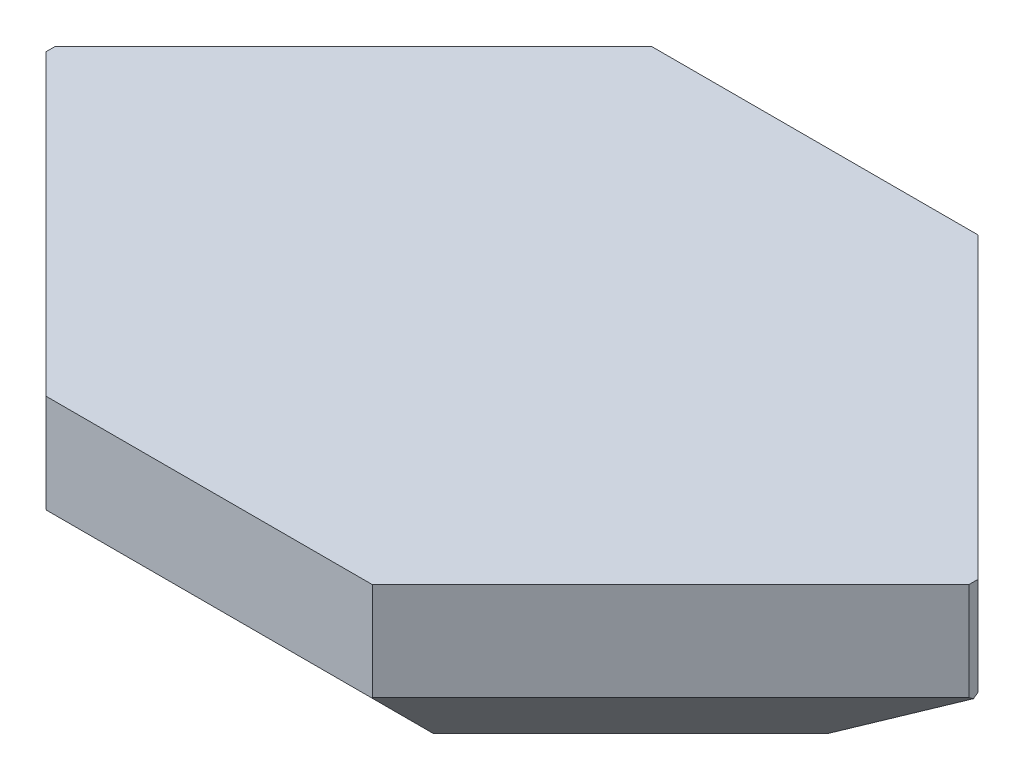
ISO-10303-21;
HEADER;
FILE_DESCRIPTION(('STEP AP214'),'2;1');
FILE_NAME('part.step','',(''),(''),'','','');
FILE_SCHEMA(('AUTOMOTIVE_DESIGN { 1 0 10303 214 1 1 1 1 }'));
ENDSEC;
DATA;
#1=APPLICATION_CONTEXT('core data for automotive mechanical design processes');
#2=APPLICATION_PROTOCOL_DEFINITION('international standard','automotive_design',2000,#1);
#3=PRODUCT_CONTEXT('',#1,'mechanical');
#4=PRODUCT('Part','Part','',(#3));
#5=PRODUCT_RELATED_PRODUCT_CATEGORY('part','',(#4));
#6=PRODUCT_DEFINITION_FORMATION('','',#4);
#7=PRODUCT_DEFINITION_CONTEXT('part definition',#1,'design');
#8=PRODUCT_DEFINITION('design','',#6,#7);
#9=PRODUCT_DEFINITION_SHAPE('','',#8);
#10=(LENGTH_UNIT() NAMED_UNIT(*) SI_UNIT(.MILLI.,.METRE.));
#11=(NAMED_UNIT(*) PLANE_ANGLE_UNIT() SI_UNIT($,.RADIAN.));
#12=(NAMED_UNIT(*) SI_UNIT($,.STERADIAN.) SOLID_ANGLE_UNIT());
#13=UNCERTAINTY_MEASURE_WITH_UNIT(LENGTH_MEASURE(1.E-05),#10,'distance_accuracy_value','');
#14=(GEOMETRIC_REPRESENTATION_CONTEXT(3) GLOBAL_UNCERTAINTY_ASSIGNED_CONTEXT((#13)) GLOBAL_UNIT_ASSIGNED_CONTEXT((#10,
#11,#12)) REPRESENTATION_CONTEXT('',''));
#15=CARTESIAN_POINT('',(0.,0.,0.));
#16=DIRECTION('',(0.,0.,1.));
#17=DIRECTION('',(1.,0.,0.));
#18=AXIS2_PLACEMENT_3D('',#15,#16,#17);
#19=CARTESIAN_POINT('',(-72.5463446356131,76.2,0.));
#20=DIRECTION('',(0.707106781186547,0.,0.707106781186548));
#21=DIRECTION('',(0.707106781186548,0.,-0.707106781186547));
#22=AXIS2_PLACEMENT_3D('',#19,#20,#21);
#23=PLANE('',#22);
#24=DIRECTION('',(-0.707106781186548,0.,0.707106781186547));
#25=VECTOR('',#24,1.);
#26=CARTESIAN_POINT('',(-72.5463446356131,67.31,0.));
#27=LINE('',#26,#25);
#28=CARTESIAN_POINT('',(-25.4,67.31,-47.146344635613));
#29=VERTEX_POINT('',#28);
#30=CARTESIAN_POINT('',(-71.8392378544265,67.31,-0.707106781186533));
#31=VERTEX_POINT('',#30);
#32=EDGE_CURVE('E258',#29,#31,#27,.T.);
#33=ORIENTED_EDGE('',*,*,#32,.T.);
#34=DIRECTION('',(0.,1.,0.));
#35=VECTOR('',#34,1.);
#36=CARTESIAN_POINT('',(-71.8392378544265,76.2,-0.707106781186533));
#37=LINE('',#36,#35);
#38=CARTESIAN_POINT('',(-71.8392378544265,82.55,-0.707106781186533));
#39=VERTEX_POINT('',#38);
#40=EDGE_CURVE('E170',#31,#39,#37,.T.);
#41=ORIENTED_EDGE('',*,*,#40,.T.);
#42=DIRECTION('',(-0.707106781186548,0.,0.707106781186547));
#43=VECTOR('',#42,1.);
#44=CARTESIAN_POINT('',(-25.4,82.55,-47.146344635613));
#45=LINE('',#44,#43);
#46=CARTESIAN_POINT('',(-25.4,82.55,-47.146344635613));
#47=VERTEX_POINT('',#46);
#48=EDGE_CURVE('E168',#47,#39,#45,.T.);
#49=ORIENTED_EDGE('',*,*,#48,.F.);
#50=DIRECTION('',(0.,-1.,0.));
#51=VECTOR('',#50,1.);
#52=CARTESIAN_POINT('',(-25.4,76.2,-47.146344635613));
#53=LINE('',#52,#51);
#54=EDGE_CURVE('E151',#47,#29,#53,.T.);
#55=ORIENTED_EDGE('',*,*,#54,.T.);
#56=EDGE_LOOP('',(#33,#41,#49,#55));
#57=FACE_BOUND('',#56,.T.);
#58=ADVANCED_FACE('F48',(#57),#23,.F.);
#59=CARTESIAN_POINT('',(-25.4,76.2,47.1463446356131));
#60=DIRECTION('',(0.707106781186548,0.,-0.707106781186547));
#61=DIRECTION('',(-0.707106781186547,0.,-0.707106781186548));
#62=AXIS2_PLACEMENT_3D('',#59,#60,#61);
#63=PLANE('',#62);
#64=DIRECTION('',(0.,-1.,0.));
#65=VECTOR('',#64,1.);
#66=CARTESIAN_POINT('',(-25.4,76.2,47.1463446356131));
#67=LINE('',#66,#65);
#68=CARTESIAN_POINT('',(-25.4,82.55,47.1463446356131));
#69=VERTEX_POINT('',#68);
#70=CARTESIAN_POINT('',(-25.4,67.31,47.1463446356131));
#71=VERTEX_POINT('',#70);
#72=EDGE_CURVE('E222',#69,#71,#67,.T.);
#73=ORIENTED_EDGE('',*,*,#72,.F.);
#74=DIRECTION('',(0.707106781186547,0.,0.707106781186548));
#75=VECTOR('',#74,1.);
#76=CARTESIAN_POINT('',(-71.8392378544265,82.55,0.707106781186566));
#77=LINE('',#76,#75);
#78=CARTESIAN_POINT('',(-71.8392378544265,82.55,0.707106781186566));
#79=VERTEX_POINT('',#78);
#80=EDGE_CURVE('E187',#79,#69,#77,.T.);
#81=ORIENTED_EDGE('',*,*,#80,.F.);
#82=DIRECTION('',(0.,-1.,0.));
#83=VECTOR('',#82,1.);
#84=CARTESIAN_POINT('',(-71.8392378544265,76.2,0.707106781186552));
#85=LINE('',#84,#83);
#86=CARTESIAN_POINT('',(-71.8392378544265,67.31,0.707106781186531));
#87=VERTEX_POINT('',#86);
#88=EDGE_CURVE('E278',#79,#87,#85,.T.);
#89=ORIENTED_EDGE('',*,*,#88,.T.);
#90=DIRECTION('',(0.707106781186547,0.,0.707106781186548));
#91=VECTOR('',#90,1.);
#92=CARTESIAN_POINT('',(-25.4,67.31,47.1463446356131));
#93=LINE('',#92,#91);
#94=EDGE_CURVE('E230',#87,#71,#93,.T.);
#95=ORIENTED_EDGE('',*,*,#94,.T.);
#96=EDGE_LOOP('',(#73,#81,#89,#95));
#97=FACE_BOUND('',#96,.T.);
#98=ADVANCED_FACE('F323',(#97),#63,.F.);
#99=CARTESIAN_POINT('',(25.4,76.2,47.1463446356131));
#100=DIRECTION('',(0.,0.,-1.));
#101=DIRECTION('',(-1.,0.,0.));
#102=AXIS2_PLACEMENT_3D('',#99,#100,#101);
#103=PLANE('',#102);
#104=ORIENTED_EDGE('',*,*,#72,.T.);
#105=DIRECTION('',(-0.816496580927727,0.577350269189624,0.));
#106=VECTOR('',#105,1.);
#107=CARTESIAN_POINT('',(-25.4,67.31,47.1463446356131));
#108=LINE('',#107,#106);
#109=CARTESIAN_POINT('',(-25.2723585694968,67.2197438789308,47.1463446356131));
#110=VERTEX_POINT('',#109);
#111=EDGE_CURVE('E236',#71,#110,#108,.F.);
#112=ORIENTED_EDGE('',*,*,#111,.T.);
#113=DIRECTION('',(1.,0.,0.));
#114=VECTOR('',#113,1.);
#115=CARTESIAN_POINT('',(25.4,67.2197438789308,47.1463446356131));
#116=LINE('',#115,#114);
#117=CARTESIAN_POINT('',(25.2723585694968,67.2197438789308,47.1463446356131));
#118=VERTEX_POINT('',#117);
#119=EDGE_CURVE('E209',#110,#118,#116,.T.);
#120=ORIENTED_EDGE('',*,*,#119,.T.);
#121=DIRECTION('',(-0.816496580927728,-0.577350269189624,0.));
#122=VECTOR('',#121,1.);
#123=CARTESIAN_POINT('',(56.8308964237422,89.535,47.1463446356131));
#124=LINE('',#123,#122);
#125=CARTESIAN_POINT('',(25.4,67.31,47.1463446356131));
#126=VERTEX_POINT('',#125);
#127=EDGE_CURVE('E233',#118,#126,#124,.F.);
#128=ORIENTED_EDGE('',*,*,#127,.T.);
#129=DIRECTION('',(0.,-1.,0.));
#130=VECTOR('',#129,1.);
#131=CARTESIAN_POINT('',(25.4,76.2,47.1463446356131));
#132=LINE('',#131,#130);
#133=CARTESIAN_POINT('',(25.4,82.55,47.1463446356131));
#134=VERTEX_POINT('',#133);
#135=EDGE_CURVE('E218',#134,#126,#132,.T.);
#136=ORIENTED_EDGE('',*,*,#135,.F.);
#137=DIRECTION('',(1.,0.,0.));
#138=VECTOR('',#137,1.);
#139=CARTESIAN_POINT('',(-25.4,82.55,47.1463446356131));
#140=LINE('',#139,#138);
#141=EDGE_CURVE('E191',#69,#134,#140,.T.);
#142=ORIENTED_EDGE('',*,*,#141,.F.);
#143=EDGE_LOOP('',(#104,#112,#120,#128,#136,#142));
#144=FACE_BOUND('',#143,.T.);
#145=ADVANCED_FACE('F327',(#144),#103,.F.);
#146=CARTESIAN_POINT('',(72.5463446356131,76.2,0.));
#147=DIRECTION('',(-0.707106781186547,0.,-0.707106781186548));
#148=DIRECTION('',(-0.707106781186548,0.,0.707106781186547));
#149=AXIS2_PLACEMENT_3D('',#146,#147,#148);
#150=PLANE('',#149);
#151=DIRECTION('',(0.707106781186548,0.,-0.707106781186547));
#152=VECTOR('',#151,1.);
#153=CARTESIAN_POINT('',(72.5463446356131,67.31,0.));
#154=LINE('',#153,#152);
#155=CARTESIAN_POINT('',(71.8392378544265,67.31,0.707106781186547));
#156=VERTEX_POINT('',#155);
#157=EDGE_CURVE('E272',#126,#156,#154,.T.);
#158=ORIENTED_EDGE('',*,*,#157,.T.);
#159=DIRECTION('',(0.,1.,0.));
#160=VECTOR('',#159,1.);
#161=CARTESIAN_POINT('',(71.8392378544265,76.2,0.707106781186547));
#162=LINE('',#161,#160);
#163=CARTESIAN_POINT('',(71.8392378544265,82.55,0.707106781186547));
#164=VERTEX_POINT('',#163);
#165=EDGE_CURVE('E12',#156,#164,#162,.T.);
#166=ORIENTED_EDGE('',*,*,#165,.T.);
#167=DIRECTION('',(0.707106781186548,0.,-0.707106781186547));
#168=VECTOR('',#167,1.);
#169=CARTESIAN_POINT('',(25.4,82.55,47.1463446356131));
#170=LINE('',#169,#168);
#171=EDGE_CURVE('E195',#134,#164,#170,.T.);
#172=ORIENTED_EDGE('',*,*,#171,.F.);
#173=ORIENTED_EDGE('',*,*,#135,.T.);
#174=EDGE_LOOP('',(#158,#166,#172,#173));
#175=FACE_BOUND('',#174,.T.);
#176=ADVANCED_FACE('F331',(#175),#150,.F.);
#177=CARTESIAN_POINT('',(25.4,76.2,-47.1463446356131));
#178=DIRECTION('',(-0.707106781186548,0.,0.707106781186547));
#179=DIRECTION('',(0.707106781186547,0.,0.707106781186548));
#180=AXIS2_PLACEMENT_3D('',#177,#178,#179);
#181=PLANE('',#180);
#182=DIRECTION('',(0.,-1.,0.));
#183=VECTOR('',#182,1.);
#184=CARTESIAN_POINT('',(25.4,76.2,-47.1463446356131));
#185=LINE('',#184,#183);
#186=CARTESIAN_POINT('',(25.4,82.55,-47.1463446356131));
#187=VERTEX_POINT('',#186);
#188=CARTESIAN_POINT('',(25.4,67.31,-47.1463446356131));
#189=VERTEX_POINT('',#188);
#190=EDGE_CURVE('E164',#187,#189,#185,.T.);
#191=ORIENTED_EDGE('',*,*,#190,.F.);
#192=DIRECTION('',(-0.707106781186547,0.,-0.707106781186548));
#193=VECTOR('',#192,1.);
#194=CARTESIAN_POINT('',(71.8392378544265,82.55,-0.707106781186552));
#195=LINE('',#194,#193);
#196=CARTESIAN_POINT('',(71.8392378544265,82.55,-0.707106781186552));
#197=VERTEX_POINT('',#196);
#198=EDGE_CURVE('E181',#197,#187,#195,.T.);
#199=ORIENTED_EDGE('',*,*,#198,.F.);
#200=DIRECTION('',(0.,-1.,0.));
#201=VECTOR('',#200,1.);
#202=CARTESIAN_POINT('',(71.8392378544265,76.2,-0.707106781186538));
#203=LINE('',#202,#201);
#204=CARTESIAN_POINT('',(71.8392378544265,67.31,-0.707106781186517));
#205=VERTEX_POINT('',#204);
#206=EDGE_CURVE('E294',#197,#205,#203,.T.);
#207=ORIENTED_EDGE('',*,*,#206,.T.);
#208=DIRECTION('',(-0.707106781186547,0.,-0.707106781186548));
#209=VECTOR('',#208,1.);
#210=CARTESIAN_POINT('',(25.4,67.31,-47.1463446356131));
#211=LINE('',#210,#209);
#212=EDGE_CURVE('E275',#205,#189,#211,.T.);
#213=ORIENTED_EDGE('',*,*,#212,.T.);
#214=EDGE_LOOP('',(#191,#199,#207,#213));
#215=FACE_BOUND('',#214,.T.);
#216=ADVANCED_FACE('F301',(#215),#181,.F.);
#217=CARTESIAN_POINT('',(-25.4,76.2,-47.146344635613));
#218=DIRECTION('',(0.,0.,1.));
#219=DIRECTION('',(1.,0.,0.));
#220=AXIS2_PLACEMENT_3D('',#217,#218,#219);
#221=PLANE('',#220);
#222=DIRECTION('',(-1.,0.,0.));
#223=VECTOR('',#222,1.);
#224=CARTESIAN_POINT('',(-25.4,67.2197438789308,-47.146344635613));
#225=LINE('',#224,#223);
#226=CARTESIAN_POINT('',(25.2723585694968,67.2197438789308,-47.1463446356131));
#227=VERTEX_POINT('',#226);
#228=CARTESIAN_POINT('',(-25.2723585694968,67.2197438789308,-47.146344635613));
#229=VERTEX_POINT('',#228);
#230=EDGE_CURVE('E165',#227,#229,#225,.T.);
#231=ORIENTED_EDGE('',*,*,#230,.T.);
#232=DIRECTION('',(0.816496580927727,-0.577350269189624,0.));
#233=VECTOR('',#232,1.);
#234=CARTESIAN_POINT('',(-56.8308964237421,89.535,-47.146344635613));
#235=LINE('',#234,#233);
#236=EDGE_CURVE('E159',#229,#29,#235,.F.);
#237=ORIENTED_EDGE('',*,*,#236,.T.);
#238=ORIENTED_EDGE('',*,*,#54,.F.);
#239=DIRECTION('',(-1.,0.,0.));
#240=VECTOR('',#239,1.);
#241=CARTESIAN_POINT('',(25.4,82.55,-47.1463446356131));
#242=LINE('',#241,#240);
#243=EDGE_CURVE('E157',#187,#47,#242,.T.);
#244=ORIENTED_EDGE('',*,*,#243,.F.);
#245=ORIENTED_EDGE('',*,*,#190,.T.);
#246=DIRECTION('',(0.816496580927727,0.577350269189624,0.));
#247=VECTOR('',#246,1.);
#248=CARTESIAN_POINT('',(25.4,67.31,-47.1463446356131));
#249=LINE('',#248,#247);
#250=EDGE_CURVE('E267',#189,#227,#249,.F.);
#251=ORIENTED_EDGE('',*,*,#250,.T.);
#252=EDGE_LOOP('',(#231,#237,#238,#244,#245,#251));
#253=FACE_BOUND('',#252,.T.);
#254=ADVANCED_FACE('F154',(#253),#221,.F.);
#255=CARTESIAN_POINT('',(0.,10.0366996216588,10.0366996216588));
#256=DIRECTION('',(0.,0.707106781186546,0.707106781186549));
#257=DIRECTION('',(0.,-0.707106781186549,0.707106781186546));
#258=AXIS2_PLACEMENT_3D('',#255,#256,#257);
#259=PLANE('',#258);
#260=DIRECTION('',(-1.,0.,0.));
#261=VECTOR('',#260,1.);
#262=CARTESIAN_POINT('',(0.,50.8,-30.7266007566823));
#263=LINE('',#262,#261);
#264=CARTESIAN_POINT('',(18.4710779641509,50.8,-30.7266007566823));
#265=VERTEX_POINT('',#264);
#266=CARTESIAN_POINT('',(-18.4710779641509,50.8,-30.7266007566823));
#267=VERTEX_POINT('',#266);
#268=EDGE_CURVE('E205',#265,#267,#263,.T.);
#269=ORIENTED_EDGE('',*,*,#268,.T.);
#270=DIRECTION('',(0.281084637714826,-0.678598344545847,0.678598344545845));
#271=VECTOR('',#270,1.);
#272=CARTESIAN_POINT('',(-20.0317624695153,54.5678256994361,-34.4944264561184));
#273=LINE('',#272,#271);
#274=EDGE_CURVE('E264',#267,#229,#273,.F.);
#275=ORIENTED_EDGE('',*,*,#274,.T.);
#276=ORIENTED_EDGE('',*,*,#230,.F.);
#277=DIRECTION('',(0.281084637714827,0.678598344545847,-0.678598344545844));
#278=VECTOR('',#277,1.);
#279=CARTESIAN_POINT('',(25.2996591115797,67.2856532178875,-47.2122539745698));
#280=LINE('',#279,#278);
#281=EDGE_CURVE('E261',#227,#265,#280,.F.);
#282=ORIENTED_EDGE('',*,*,#281,.T.);
#283=EDGE_LOOP('',(#269,#275,#276,#282));
#284=FACE_BOUND('',#283,.T.);
#285=ADVANCED_FACE('F310',(#284),#259,.F.);
#286=CARTESIAN_POINT('',(0.,10.0366996216588,-10.0366996216588));
#287=DIRECTION('',(0.,0.707106781186546,-0.707106781186549));
#288=DIRECTION('',(0.,0.707106781186549,0.707106781186546));
#289=AXIS2_PLACEMENT_3D('',#286,#287,#288);
#290=PLANE('',#289);
#291=ORIENTED_EDGE('',*,*,#119,.F.);
#292=DIRECTION('',(-0.281084637714827,0.678598344545847,0.678598344545844));
#293=VECTOR('',#292,1.);
#294=CARTESIAN_POINT('',(-25.2996591115797,67.2856532178875,47.2122539745698));
#295=LINE('',#294,#293);
#296=CARTESIAN_POINT('',(-18.4710779641509,50.8,30.7266007566823));
#297=VERTEX_POINT('',#296);
#298=EDGE_CURVE('E242',#110,#297,#295,.F.);
#299=ORIENTED_EDGE('',*,*,#298,.T.);
#300=DIRECTION('',(1.,0.,0.));
#301=VECTOR('',#300,1.);
#302=CARTESIAN_POINT('',(0.,50.8,30.7266007566823));
#303=LINE('',#302,#301);
#304=CARTESIAN_POINT('',(18.4710779641509,50.8,30.7266007566823));
#305=VERTEX_POINT('',#304);
#306=EDGE_CURVE('E226',#297,#305,#303,.T.);
#307=ORIENTED_EDGE('',*,*,#306,.T.);
#308=DIRECTION('',(-0.281084637714827,-0.678598344545847,-0.678598344545844));
#309=VECTOR('',#308,1.);
#310=CARTESIAN_POINT('',(20.0317624695153,54.5678256994362,34.4944264561185));
#311=LINE('',#310,#309);
#312=EDGE_CURVE('E239',#305,#118,#311,.F.);
#313=ORIENTED_EDGE('',*,*,#312,.T.);
#314=EDGE_LOOP('',(#291,#299,#307,#313));
#315=FACE_BOUND('',#314,.T.);
#316=ADVANCED_FACE('F443',(#315),#290,.F.);
#317=CARTESIAN_POINT('',(0.,50.8,0.));
#318=DIRECTION('',(0.,1.,0.));
#319=DIRECTION('',(0.,0.,1.));
#320=AXIS2_PLACEMENT_3D('',#317,#318,#319);
#321=PLANE('',#320);
#322=ORIENTED_EDGE('',*,*,#306,.F.);
#323=DIRECTION('',(-0.707106781186547,0.,-0.707106781186548));
#324=VECTOR('',#323,1.);
#325=CARTESIAN_POINT('',(-24.5988393604166,50.8,24.5988393604166));
#326=LINE('',#325,#324);
#327=CARTESIAN_POINT('',(-49.1976787208332,50.8,0.));
#328=VERTEX_POINT('',#327);
#329=EDGE_CURVE('E254',#297,#328,#326,.T.);
#330=ORIENTED_EDGE('',*,*,#329,.T.);
#331=DIRECTION('',(0.707106781186548,0.,-0.707106781186547));
#332=VECTOR('',#331,1.);
#333=CARTESIAN_POINT('',(-24.5988393604166,50.8,-24.5988393604166));
#334=LINE('',#333,#332);
#335=EDGE_CURVE('E251',#328,#267,#334,.T.);
#336=ORIENTED_EDGE('',*,*,#335,.T.);
#337=ORIENTED_EDGE('',*,*,#268,.F.);
#338=DIRECTION('',(0.707106781186547,0.,0.707106781186548));
#339=VECTOR('',#338,1.);
#340=CARTESIAN_POINT('',(24.5988393604166,50.8,-24.5988393604166));
#341=LINE('',#340,#339);
#342=CARTESIAN_POINT('',(49.1976787208331,50.8,0.));
#343=VERTEX_POINT('',#342);
#344=EDGE_CURVE('E245',#265,#343,#341,.T.);
#345=ORIENTED_EDGE('',*,*,#344,.T.);
#346=DIRECTION('',(-0.707106781186548,0.,0.707106781186547));
#347=VECTOR('',#346,1.);
#348=CARTESIAN_POINT('',(24.5988393604166,50.8,24.5988393604166));
#349=LINE('',#348,#347);
#350=EDGE_CURVE('E248',#343,#305,#349,.T.);
#351=ORIENTED_EDGE('',*,*,#350,.T.);
#352=EDGE_LOOP('',(#322,#330,#336,#337,#345,#351));
#353=FACE_BOUND('',#352,.T.);
#354=ADVANCED_FACE('F361',(#353),#321,.F.);
#355=CARTESIAN_POINT('',(-72.5463446356131,67.31,0.));
#356=DIRECTION('',(0.499999999999999,0.707106781186549,0.499999999999999));
#357=DIRECTION('',(-0.707106781186548,0.,0.707106781186547));
#358=AXIS2_PLACEMENT_3D('',#355,#356,#357);
#359=PLANE('',#358);
#360=DIRECTION('',(-0.816496580927727,0.577350269189624,0.));
#361=VECTOR('',#360,1.);
#362=CARTESIAN_POINT('',(-72.5463446356131,67.31,0.));
#363=LINE('',#362,#361);
#364=CARTESIAN_POINT('',(-71.8392378544265,66.81,0.));
#365=VERTEX_POINT('',#364);
#366=EDGE_CURVE('E210',#365,#328,#363,.F.);
#367=ORIENTED_EDGE('',*,*,#366,.F.);
#368=DIRECTION('',(0.,0.577350269189632,-0.816496580927722));
#369=VECTOR('',#368,1.);
#370=CARTESIAN_POINT('',(-71.8392378544265,66.9766666666667,-0.235702260395527));
#371=LINE('',#370,#369);
#372=EDGE_CURVE('E289',#365,#31,#371,.T.);
#373=ORIENTED_EDGE('',*,*,#372,.T.);
#374=ORIENTED_EDGE('',*,*,#32,.F.);
#375=ORIENTED_EDGE('',*,*,#236,.F.);
#376=ORIENTED_EDGE('',*,*,#274,.F.);
#377=ORIENTED_EDGE('',*,*,#335,.F.);
#378=EDGE_LOOP('',(#367,#373,#374,#375,#376,#377));
#379=FACE_BOUND('',#378,.T.);
#380=ADVANCED_FACE('F316',(#379),#359,.F.);
#381=CARTESIAN_POINT('',(-25.4,67.31,47.1463446356131));
#382=DIRECTION('',(0.499999999999999,0.707106781186549,-0.499999999999999));
#383=DIRECTION('',(0.707106781186547,0.,0.707106781186548));
#384=AXIS2_PLACEMENT_3D('',#381,#382,#383);
#385=PLANE('',#384);
#386=ORIENTED_EDGE('',*,*,#94,.F.);
#387=DIRECTION('',(0.,-0.577350269189617,-0.816496580927733));
#388=VECTOR('',#387,1.);
#389=CARTESIAN_POINT('',(-71.8392378544259,89.2016666666669,31.6665986841387));
#390=LINE('',#389,#388);
#391=EDGE_CURVE('E286',#87,#365,#390,.T.);
#392=ORIENTED_EDGE('',*,*,#391,.T.);
#393=ORIENTED_EDGE('',*,*,#366,.T.);
#394=ORIENTED_EDGE('',*,*,#329,.F.);
#395=ORIENTED_EDGE('',*,*,#298,.F.);
#396=ORIENTED_EDGE('',*,*,#111,.F.);
#397=EDGE_LOOP('',(#386,#392,#393,#394,#395,#396));
#398=FACE_BOUND('',#397,.T.);
#399=ADVANCED_FACE('F349',(#398),#385,.F.);
#400=CARTESIAN_POINT('',(25.4,67.31,-47.1463446356131));
#401=DIRECTION('',(-0.499999999999999,0.707106781186549,0.499999999999999));
#402=DIRECTION('',(-0.707106781186547,0.,-0.707106781186548));
#403=AXIS2_PLACEMENT_3D('',#400,#401,#402);
#404=PLANE('',#403);
#405=ORIENTED_EDGE('',*,*,#212,.F.);
#406=DIRECTION('',(0.,-0.577350269189616,0.816496580927733));
#407=VECTOR('',#406,1.);
#408=CARTESIAN_POINT('',(71.8392378544259,89.2016666666669,-31.6665986841387));
#409=LINE('',#408,#407);
#410=CARTESIAN_POINT('',(71.8392378544265,66.81,0.));
#411=VERTEX_POINT('',#410);
#412=EDGE_CURVE('E72',#205,#411,#409,.T.);
#413=ORIENTED_EDGE('',*,*,#412,.T.);
#414=DIRECTION('',(-0.816496580927727,-0.577350269189624,0.));
#415=VECTOR('',#414,1.);
#416=CARTESIAN_POINT('',(41.1154482118709,45.085,0.));
#417=LINE('',#416,#415);
#418=EDGE_CURVE('E204',#343,#411,#417,.F.);
#419=ORIENTED_EDGE('',*,*,#418,.F.);
#420=ORIENTED_EDGE('',*,*,#344,.F.);
#421=ORIENTED_EDGE('',*,*,#281,.F.);
#422=ORIENTED_EDGE('',*,*,#250,.F.);
#423=EDGE_LOOP('',(#405,#413,#419,#420,#421,#422));
#424=FACE_BOUND('',#423,.T.);
#425=ADVANCED_FACE('F305',(#424),#404,.F.);
#426=CARTESIAN_POINT('',(72.5463446356131,67.31,0.));
#427=DIRECTION('',(-0.499999999999999,0.707106781186549,-0.499999999999999));
#428=DIRECTION('',(0.707106781186548,0.,-0.707106781186547));
#429=AXIS2_PLACEMENT_3D('',#426,#427,#428);
#430=PLANE('',#429);
#431=ORIENTED_EDGE('',*,*,#418,.T.);
#432=DIRECTION('',(0.,0.577350269189631,0.816496580927722));
#433=VECTOR('',#432,1.);
#434=CARTESIAN_POINT('',(71.8392378544265,66.9766666666667,0.23570226039554));
#435=LINE('',#434,#433);
#436=EDGE_CURVE('E58',#411,#156,#435,.T.);
#437=ORIENTED_EDGE('',*,*,#436,.T.);
#438=ORIENTED_EDGE('',*,*,#157,.F.);
#439=ORIENTED_EDGE('',*,*,#127,.F.);
#440=ORIENTED_EDGE('',*,*,#312,.F.);
#441=ORIENTED_EDGE('',*,*,#350,.F.);
#442=EDGE_LOOP('',(#431,#437,#438,#439,#440,#441));
#443=FACE_BOUND('',#442,.T.);
#444=ADVANCED_FACE('F339',(#443),#430,.F.);
#445=CARTESIAN_POINT('',(-71.8392378544265,76.2,0.707106781186545));
#446=DIRECTION('',(1.,0.,0.));
#447=DIRECTION('',(0.,-1.,0.));
#448=AXIS2_PLACEMENT_3D('',#445,#446,#447);
#449=PLANE('',#448);
#450=ORIENTED_EDGE('',*,*,#88,.F.);
#451=DIRECTION('',(0.,0.,1.));
#452=VECTOR('',#451,1.);
#453=CARTESIAN_POINT('',(-71.8392378544265,82.55,-0.707106781186533));
#454=LINE('',#453,#452);
#455=EDGE_CURVE('E175',#39,#79,#454,.T.);
#456=ORIENTED_EDGE('',*,*,#455,.F.);
#457=ORIENTED_EDGE('',*,*,#40,.F.);
#458=ORIENTED_EDGE('',*,*,#372,.F.);
#459=ORIENTED_EDGE('',*,*,#391,.F.);
#460=EDGE_LOOP('',(#450,#456,#457,#458,#459));
#461=FACE_BOUND('',#460,.T.);
#462=ADVANCED_FACE('F319',(#461),#449,.F.);
#463=CARTESIAN_POINT('',(71.8392378544265,76.2,-0.707106781186531));
#464=DIRECTION('',(-1.,0.,0.));
#465=DIRECTION('',(0.,-1.,0.));
#466=AXIS2_PLACEMENT_3D('',#463,#464,#465);
#467=PLANE('',#466);
#468=ORIENTED_EDGE('',*,*,#206,.F.);
#469=DIRECTION('',(0.,0.,-1.));
#470=VECTOR('',#469,1.);
#471=CARTESIAN_POINT('',(71.8392378544265,82.55,0.707106781186547));
#472=LINE('',#471,#470);
#473=EDGE_CURVE('E199',#164,#197,#472,.T.);
#474=ORIENTED_EDGE('',*,*,#473,.F.);
#475=ORIENTED_EDGE('',*,*,#165,.F.);
#476=ORIENTED_EDGE('',*,*,#436,.F.);
#477=ORIENTED_EDGE('',*,*,#412,.F.);
#478=EDGE_LOOP('',(#468,#474,#475,#476,#477));
#479=FACE_BOUND('',#478,.T.);
#480=ADVANCED_FACE('F51',(#479),#467,.F.);
#481=CARTESIAN_POINT('',(0.,82.55,0.));
#482=DIRECTION('',(0.,1.,0.));
#483=DIRECTION('',(0.,0.,1.));
#484=AXIS2_PLACEMENT_3D('',#481,#482,#483);
#485=PLANE('',#484);
#486=ORIENTED_EDGE('',*,*,#243,.T.);
#487=ORIENTED_EDGE('',*,*,#48,.T.);
#488=ORIENTED_EDGE('',*,*,#455,.T.);
#489=ORIENTED_EDGE('',*,*,#80,.T.);
#490=ORIENTED_EDGE('',*,*,#141,.T.);
#491=ORIENTED_EDGE('',*,*,#171,.T.);
#492=ORIENTED_EDGE('',*,*,#473,.T.);
#493=ORIENTED_EDGE('',*,*,#198,.T.);
#494=EDGE_LOOP('',(#486,#487,#488,#489,#490,#491,#492,#493));
#495=FACE_BOUND('',#494,.T.);
#496=ADVANCED_FACE('F178',(#495),#485,.T.);
#497=CLOSED_SHELL('',(#58,#98,#145,#176,#216,#254,#285,#316,#354,#380,#399,#425,#444,#462,#480,#496));
#498=MANIFOLD_SOLID_BREP('B2',#497);
#499=ADVANCED_BREP_SHAPE_REPRESENTATION('',(#18,#498),#14);
#500=SHAPE_DEFINITION_REPRESENTATION(#9,#499);
ENDSEC;
END-ISO-10303-21;
